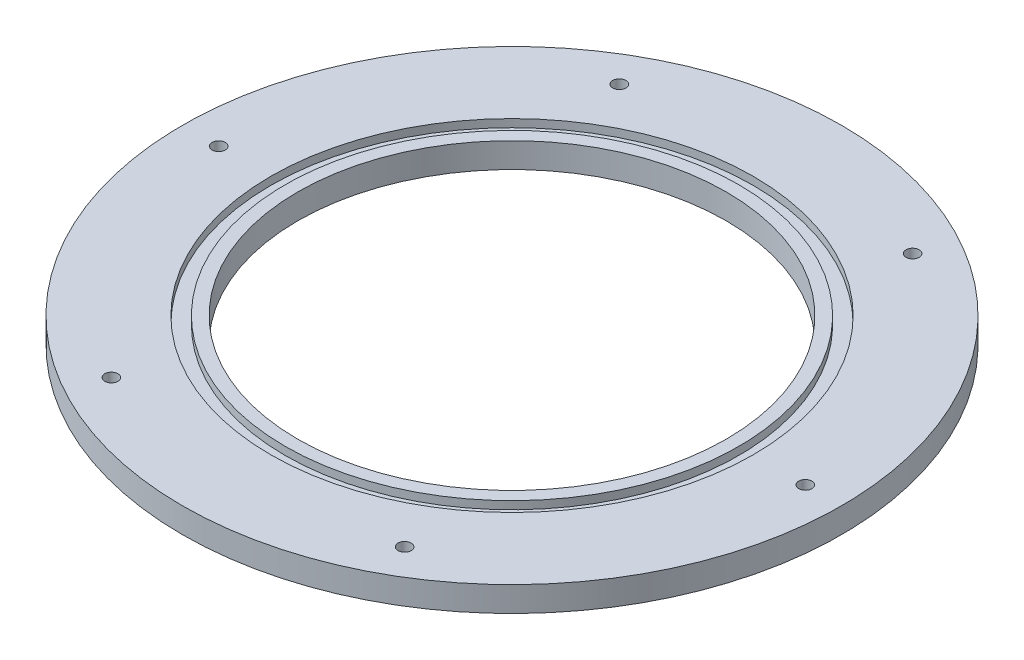
ISO-10303-21;
HEADER;
FILE_DESCRIPTION(('STEP AP214'),'2;1');
FILE_NAME('part.step','',(''),(''),'','','');
FILE_SCHEMA(('AUTOMOTIVE_DESIGN { 1 0 10303 214 1 1 1 1 }'));
ENDSEC;
DATA;
#1=APPLICATION_CONTEXT('core data for automotive mechanical design processes');
#2=APPLICATION_PROTOCOL_DEFINITION('international standard','automotive_design',2000,#1);
#3=PRODUCT_CONTEXT('',#1,'mechanical');
#4=PRODUCT('Part','Part','',(#3));
#5=PRODUCT_RELATED_PRODUCT_CATEGORY('part','',(#4));
#6=PRODUCT_DEFINITION_FORMATION('','',#4);
#7=PRODUCT_DEFINITION_CONTEXT('part definition',#1,'design');
#8=PRODUCT_DEFINITION('design','',#6,#7);
#9=PRODUCT_DEFINITION_SHAPE('','',#8);
#10=(LENGTH_UNIT() NAMED_UNIT(*) SI_UNIT(.MILLI.,.METRE.));
#11=(NAMED_UNIT(*) PLANE_ANGLE_UNIT() SI_UNIT($,.RADIAN.));
#12=(NAMED_UNIT(*) SI_UNIT($,.STERADIAN.) SOLID_ANGLE_UNIT());
#13=UNCERTAINTY_MEASURE_WITH_UNIT(LENGTH_MEASURE(1.E-05),#10,'distance_accuracy_value','');
#14=(GEOMETRIC_REPRESENTATION_CONTEXT(3) GLOBAL_UNCERTAINTY_ASSIGNED_CONTEXT((#13)) GLOBAL_UNIT_ASSIGNED_CONTEXT((#10,
#11,#12)) REPRESENTATION_CONTEXT('',''));
#15=CARTESIAN_POINT('',(0.,0.,0.));
#16=DIRECTION('',(0.,0.,1.));
#17=DIRECTION('',(1.,0.,0.));
#18=AXIS2_PLACEMENT_3D('',#15,#16,#17);
#19=CARTESIAN_POINT('',(0.,9.5,0.));
#20=DIRECTION('',(0.,1.,0.));
#21=DIRECTION('',(0.,0.,1.));
#22=AXIS2_PLACEMENT_3D('',#19,#20,#21);
#23=PLANE('',#22);
#24=CARTESIAN_POINT('',(0.,9.5,0.));
#25=DIRECTION('',(0.,1.,0.));
#26=DIRECTION('',(0.,0.,1.));
#27=AXIS2_PLACEMENT_3D('',#24,#25,#26);
#28=CIRCLE('',#27,162.5);
#29=CARTESIAN_POINT('',(0.,9.5,162.5));
#30=VERTEX_POINT('',#29);
#31=EDGE_CURVE('E49',#30,#30,#28,.T.);
#32=ORIENTED_EDGE('',*,*,#31,.F.);
#33=EDGE_LOOP('',(#32));
#34=FACE_BOUND('',#33,.T.);
#35=CARTESIAN_POINT('',(0.,9.5,0.));
#36=DIRECTION('',(0.,1.,0.));
#37=DIRECTION('',(0.,0.,1.));
#38=AXIS2_PLACEMENT_3D('',#35,#36,#37);
#39=CIRCLE('',#38,172.);
#40=CARTESIAN_POINT('',(0.,9.5,172.));
#41=VERTEX_POINT('',#40);
#42=EDGE_CURVE('E115',#41,#41,#39,.T.);
#43=ORIENTED_EDGE('',*,*,#42,.T.);
#44=EDGE_LOOP('',(#43));
#45=FACE_BOUND('',#44,.T.);
#46=ADVANCED_FACE('F36',(#34,#45),#23,.T.);
#47=CARTESIAN_POINT('',(0.,9.5,0.));
#48=DIRECTION('',(0.,1.,0.));
#49=DIRECTION('',(0.,0.,1.));
#50=AXIS2_PLACEMENT_3D('',#47,#48,#49);
#51=CIRCLE('',#50,183.);
#52=CARTESIAN_POINT('',(0.,9.5,183.));
#53=VERTEX_POINT('',#52);
#54=EDGE_CURVE('E107',#53,#53,#51,.T.);
#55=ORIENTED_EDGE('',*,*,#54,.F.);
#56=EDGE_LOOP('',(#55));
#57=FACE_BOUND('',#56,.T.);
#58=CARTESIAN_POINT('',(111.25,9.5,192.690652342038));
#59=DIRECTION('',(0.,1.,0.));
#60=DIRECTION('',(0.,0.,-1.));
#61=AXIS2_PLACEMENT_3D('',#58,#59,#60);
#62=CIRCLE('',#61,5.00000000000001);
#63=CARTESIAN_POINT('',(111.25,9.5,187.690652342038));
#64=VERTEX_POINT('',#63);
#65=EDGE_CURVE('E83',#64,#64,#62,.T.);
#66=ORIENTED_EDGE('',*,*,#65,.F.);
#67=EDGE_LOOP('',(#66));
#68=FACE_BOUND('',#67,.T.);
#69=CARTESIAN_POINT('',(-111.250000000001,9.5,-192.690652342037));
#70=DIRECTION('',(0.,1.,0.));
#71=DIRECTION('',(0.,0.,-1.));
#72=AXIS2_PLACEMENT_3D('',#69,#70,#71);
#73=CIRCLE('',#72,5.00000000000001);
#74=CARTESIAN_POINT('',(-111.250000000001,9.5,-197.690652342037));
#75=VERTEX_POINT('',#74);
#76=EDGE_CURVE('E92',#75,#75,#73,.T.);
#77=ORIENTED_EDGE('',*,*,#76,.F.);
#78=EDGE_LOOP('',(#77));
#79=FACE_BOUND('',#78,.T.);
#80=CARTESIAN_POINT('',(-222.5,9.5,1.55431223447522E-12));
#81=DIRECTION('',(0.,1.,0.));
#82=DIRECTION('',(0.,0.,-1.));
#83=AXIS2_PLACEMENT_3D('',#80,#81,#82);
#84=CIRCLE('',#83,4.99999999999992);
#85=CARTESIAN_POINT('',(-222.5,9.5,-4.99999999999837));
#86=VERTEX_POINT('',#85);
#87=EDGE_CURVE('E67',#86,#86,#84,.T.);
#88=ORIENTED_EDGE('',*,*,#87,.F.);
#89=EDGE_LOOP('',(#88));
#90=FACE_BOUND('',#89,.T.);
#91=CARTESIAN_POINT('',(222.5,9.5,0.));
#92=DIRECTION('',(0.,1.,0.));
#93=DIRECTION('',(0.,0.,1.));
#94=AXIS2_PLACEMENT_3D('',#91,#92,#93);
#95=CIRCLE('',#94,4.99999999999999);
#96=CARTESIAN_POINT('',(222.5,9.5,4.99999999999999));
#97=VERTEX_POINT('',#96);
#98=EDGE_CURVE('E76',#97,#97,#95,.T.);
#99=ORIENTED_EDGE('',*,*,#98,.F.);
#100=EDGE_LOOP('',(#99));
#101=FACE_BOUND('',#100,.T.);
#102=CARTESIAN_POINT('',(-111.250000000001,9.5,192.690652342037));
#103=DIRECTION('',(0.,1.,0.));
#104=DIRECTION('',(0.,0.,1.));
#105=AXIS2_PLACEMENT_3D('',#102,#103,#104);
#106=CIRCLE('',#105,5.00000000000001);
#107=CARTESIAN_POINT('',(-111.250000000001,9.5,197.690652342037));
#108=VERTEX_POINT('',#107);
#109=EDGE_CURVE('E99',#108,#108,#106,.T.);
#110=ORIENTED_EDGE('',*,*,#109,.F.);
#111=EDGE_LOOP('',(#110));
#112=FACE_BOUND('',#111,.T.);
#113=CARTESIAN_POINT('',(111.25,9.5,-192.690652342038));
#114=DIRECTION('',(0.,1.,0.));
#115=DIRECTION('',(0.,0.,1.));
#116=AXIS2_PLACEMENT_3D('',#113,#114,#115);
#117=CIRCLE('',#116,5.00000000000001);
#118=CARTESIAN_POINT('',(111.25,9.5,-187.690652342038));
#119=VERTEX_POINT('',#118);
#120=EDGE_CURVE('E59',#119,#119,#117,.T.);
#121=ORIENTED_EDGE('',*,*,#120,.F.);
#122=EDGE_LOOP('',(#121));
#123=FACE_BOUND('',#122,.T.);
#124=CARTESIAN_POINT('',(0.,9.5,0.));
#125=DIRECTION('',(0.,1.,0.));
#126=DIRECTION('',(0.,0.,1.));
#127=AXIS2_PLACEMENT_3D('',#124,#125,#126);
#128=CIRCLE('',#127,250.);
#129=CARTESIAN_POINT('',(0.,9.5,250.));
#130=VERTEX_POINT('',#129);
#131=EDGE_CURVE('E10',#130,#130,#128,.T.);
#132=ORIENTED_EDGE('',*,*,#131,.T.);
#133=EDGE_LOOP('',(#132));
#134=FACE_BOUND('',#133,.T.);
#135=ADVANCED_FACE('F139',(#57,#68,#79,#90,#101,#112,#123,#134),#23,.T.);
#136=CARTESIAN_POINT('',(0.,-9.5,0.));
#137=DIRECTION('',(0.,1.,0.));
#138=DIRECTION('',(0.,0.,1.));
#139=AXIS2_PLACEMENT_3D('',#136,#137,#138);
#140=PLANE('',#139);
#141=CARTESIAN_POINT('',(111.25,-9.5,192.690652342038));
#142=DIRECTION('',(0.,1.,0.));
#143=DIRECTION('',(0.,0.,-1.));
#144=AXIS2_PLACEMENT_3D('',#141,#142,#143);
#145=CIRCLE('',#144,5.00000000000001);
#146=CARTESIAN_POINT('',(111.25,-9.5,187.690652342038));
#147=VERTEX_POINT('',#146);
#148=EDGE_CURVE('E87',#147,#147,#145,.T.);
#149=ORIENTED_EDGE('',*,*,#148,.T.);
#150=EDGE_LOOP('',(#149));
#151=FACE_BOUND('',#150,.T.);
#152=CARTESIAN_POINT('',(-111.250000000001,-9.5,-192.690652342037));
#153=DIRECTION('',(0.,1.,0.));
#154=DIRECTION('',(0.,0.,-1.));
#155=AXIS2_PLACEMENT_3D('',#152,#153,#154);
#156=CIRCLE('',#155,5.00000000000001);
#157=CARTESIAN_POINT('',(-111.250000000001,-9.5,-197.690652342037));
#158=VERTEX_POINT('',#157);
#159=EDGE_CURVE('E72',#158,#158,#156,.T.);
#160=ORIENTED_EDGE('',*,*,#159,.T.);
#161=EDGE_LOOP('',(#160));
#162=FACE_BOUND('',#161,.T.);
#163=CARTESIAN_POINT('',(-222.5,-9.5,1.55431223447522E-12));
#164=DIRECTION('',(0.,1.,0.));
#165=DIRECTION('',(0.,0.,-1.));
#166=AXIS2_PLACEMENT_3D('',#163,#164,#165);
#167=CIRCLE('',#166,4.99999999999992);
#168=CARTESIAN_POINT('',(-222.5,-9.5,-4.99999999999837));
#169=VERTEX_POINT('',#168);
#170=EDGE_CURVE('E71',#169,#169,#167,.T.);
#171=ORIENTED_EDGE('',*,*,#170,.T.);
#172=EDGE_LOOP('',(#171));
#173=FACE_BOUND('',#172,.T.);
#174=CARTESIAN_POINT('',(222.5,-9.5,0.));
#175=DIRECTION('',(0.,1.,0.));
#176=DIRECTION('',(0.,0.,1.));
#177=AXIS2_PLACEMENT_3D('',#174,#175,#176);
#178=CIRCLE('',#177,4.99999999999999);
#179=CARTESIAN_POINT('',(222.5,-9.5,4.99999999999999));
#180=VERTEX_POINT('',#179);
#181=EDGE_CURVE('E63',#180,#180,#178,.T.);
#182=ORIENTED_EDGE('',*,*,#181,.T.);
#183=EDGE_LOOP('',(#182));
#184=FACE_BOUND('',#183,.T.);
#185=CARTESIAN_POINT('',(-111.250000000001,-9.5,192.690652342037));
#186=DIRECTION('',(0.,1.,0.));
#187=DIRECTION('',(0.,0.,1.));
#188=AXIS2_PLACEMENT_3D('',#185,#186,#187);
#189=CIRCLE('',#188,5.00000000000001);
#190=CARTESIAN_POINT('',(-111.250000000001,-9.5,197.690652342037));
#191=VERTEX_POINT('',#190);
#192=EDGE_CURVE('E88',#191,#191,#189,.T.);
#193=ORIENTED_EDGE('',*,*,#192,.T.);
#194=EDGE_LOOP('',(#193));
#195=FACE_BOUND('',#194,.T.);
#196=CARTESIAN_POINT('',(111.25,-9.5,-192.690652342038));
#197=DIRECTION('',(0.,1.,0.));
#198=DIRECTION('',(0.,0.,1.));
#199=AXIS2_PLACEMENT_3D('',#196,#197,#198);
#200=CIRCLE('',#199,5.00000000000001);
#201=CARTESIAN_POINT('',(111.25,-9.5,-187.690652342038));
#202=VERTEX_POINT('',#201);
#203=EDGE_CURVE('E55',#202,#202,#200,.T.);
#204=ORIENTED_EDGE('',*,*,#203,.T.);
#205=EDGE_LOOP('',(#204));
#206=FACE_BOUND('',#205,.T.);
#207=CARTESIAN_POINT('',(0.,-9.5,0.));
#208=DIRECTION('',(0.,1.,0.));
#209=DIRECTION('',(0.,0.,1.));
#210=AXIS2_PLACEMENT_3D('',#207,#208,#209);
#211=CIRCLE('',#210,250.);
#212=CARTESIAN_POINT('',(0.,-9.5,250.));
#213=VERTEX_POINT('',#212);
#214=EDGE_CURVE('E40',#213,#213,#211,.T.);
#215=ORIENTED_EDGE('',*,*,#214,.F.);
#216=EDGE_LOOP('',(#215));
#217=FACE_BOUND('',#216,.T.);
#218=CARTESIAN_POINT('',(0.,-9.5,0.));
#219=DIRECTION('',(0.,1.,0.));
#220=DIRECTION('',(0.,0.,1.));
#221=AXIS2_PLACEMENT_3D('',#218,#219,#220);
#222=CIRCLE('',#221,162.5);
#223=CARTESIAN_POINT('',(0.,-9.5,162.5));
#224=VERTEX_POINT('',#223);
#225=EDGE_CURVE('E51',#224,#224,#222,.T.);
#226=ORIENTED_EDGE('',*,*,#225,.T.);
#227=EDGE_LOOP('',(#226));
#228=FACE_BOUND('',#227,.T.);
#229=ADVANCED_FACE('F142',(#151,#162,#173,#184,#195,#206,#217,#228),#140,.F.);
#230=CARTESIAN_POINT('',(0.,9.5,0.));
#231=DIRECTION('',(0.,-1.,0.));
#232=DIRECTION('',(0.,0.,-1.));
#233=AXIS2_PLACEMENT_3D('',#230,#231,#232);
#234=CYLINDRICAL_SURFACE('',#233,250.);
#235=ORIENTED_EDGE('',*,*,#131,.F.);
#236=EDGE_LOOP('',(#235));
#237=FACE_BOUND('',#236,.T.);
#238=ORIENTED_EDGE('',*,*,#214,.T.);
#239=EDGE_LOOP('',(#238));
#240=FACE_BOUND('',#239,.T.);
#241=ADVANCED_FACE('F38',(#237,#240),#234,.T.);
#242=CARTESIAN_POINT('',(0.,9.5,0.));
#243=DIRECTION('',(0.,-1.,0.));
#244=DIRECTION('',(0.,0.,-1.));
#245=AXIS2_PLACEMENT_3D('',#242,#243,#244);
#246=CYLINDRICAL_SURFACE('',#245,162.5);
#247=ORIENTED_EDGE('',*,*,#31,.T.);
#248=EDGE_LOOP('',(#247));
#249=FACE_BOUND('',#248,.T.);
#250=ORIENTED_EDGE('',*,*,#225,.F.);
#251=EDGE_LOOP('',(#250));
#252=FACE_BOUND('',#251,.T.);
#253=ADVANCED_FACE('F159',(#249,#252),#246,.F.);
#254=CARTESIAN_POINT('',(111.25,-9.5,-192.690652342038));
#255=DIRECTION('',(0.,1.,0.));
#256=DIRECTION('',(0.,0.,1.));
#257=AXIS2_PLACEMENT_3D('',#254,#255,#256);
#258=CYLINDRICAL_SURFACE('',#257,5.00000000000001);
#259=ORIENTED_EDGE('',*,*,#203,.F.);
#260=EDGE_LOOP('',(#259));
#261=FACE_BOUND('',#260,.T.);
#262=ORIENTED_EDGE('',*,*,#120,.T.);
#263=EDGE_LOOP('',(#262));
#264=FACE_BOUND('',#263,.T.);
#265=ADVANCED_FACE('F156',(#261,#264),#258,.F.);
#266=CARTESIAN_POINT('',(-111.250000000001,-9.5,192.690652342037));
#267=DIRECTION('',(0.,1.,0.));
#268=DIRECTION('',(0.,0.,1.));
#269=AXIS2_PLACEMENT_3D('',#266,#267,#268);
#270=CYLINDRICAL_SURFACE('',#269,5.00000000000001);
#271=ORIENTED_EDGE('',*,*,#192,.F.);
#272=EDGE_LOOP('',(#271));
#273=FACE_BOUND('',#272,.T.);
#274=ORIENTED_EDGE('',*,*,#109,.T.);
#275=EDGE_LOOP('',(#274));
#276=FACE_BOUND('',#275,.T.);
#277=ADVANCED_FACE('F158',(#273,#276),#270,.F.);
#278=CARTESIAN_POINT('',(222.5,-9.5,0.));
#279=DIRECTION('',(0.,1.,0.));
#280=DIRECTION('',(0.,0.,1.));
#281=AXIS2_PLACEMENT_3D('',#278,#279,#280);
#282=CYLINDRICAL_SURFACE('',#281,4.99999999999999);
#283=ORIENTED_EDGE('',*,*,#181,.F.);
#284=EDGE_LOOP('',(#283));
#285=FACE_BOUND('',#284,.T.);
#286=ORIENTED_EDGE('',*,*,#98,.T.);
#287=EDGE_LOOP('',(#286));
#288=FACE_BOUND('',#287,.T.);
#289=ADVANCED_FACE('F166',(#285,#288),#282,.F.);
#290=CARTESIAN_POINT('',(-222.5,-9.5,1.55431223447522E-12));
#291=DIRECTION('',(0.,1.,0.));
#292=DIRECTION('',(0.,0.,1.));
#293=AXIS2_PLACEMENT_3D('',#290,#291,#292);
#294=CYLINDRICAL_SURFACE('',#293,4.99999999999992);
#295=ORIENTED_EDGE('',*,*,#170,.F.);
#296=EDGE_LOOP('',(#295));
#297=FACE_BOUND('',#296,.T.);
#298=ORIENTED_EDGE('',*,*,#87,.T.);
#299=EDGE_LOOP('',(#298));
#300=FACE_BOUND('',#299,.T.);
#301=ADVANCED_FACE('F207',(#297,#300),#294,.F.);
#302=CARTESIAN_POINT('',(-111.250000000001,-9.5,-192.690652342037));
#303=DIRECTION('',(0.,1.,0.));
#304=DIRECTION('',(0.,0.,1.));
#305=AXIS2_PLACEMENT_3D('',#302,#303,#304);
#306=CYLINDRICAL_SURFACE('',#305,5.00000000000001);
#307=ORIENTED_EDGE('',*,*,#159,.F.);
#308=EDGE_LOOP('',(#307));
#309=FACE_BOUND('',#308,.T.);
#310=ORIENTED_EDGE('',*,*,#76,.T.);
#311=EDGE_LOOP('',(#310));
#312=FACE_BOUND('',#311,.T.);
#313=ADVANCED_FACE('F212',(#309,#312),#306,.F.);
#314=CARTESIAN_POINT('',(111.25,-9.5,192.690652342038));
#315=DIRECTION('',(0.,1.,0.));
#316=DIRECTION('',(0.,0.,1.));
#317=AXIS2_PLACEMENT_3D('',#314,#315,#316);
#318=CYLINDRICAL_SURFACE('',#317,5.00000000000001);
#319=ORIENTED_EDGE('',*,*,#148,.F.);
#320=EDGE_LOOP('',(#319));
#321=FACE_BOUND('',#320,.T.);
#322=ORIENTED_EDGE('',*,*,#65,.T.);
#323=EDGE_LOOP('',(#322));
#324=FACE_BOUND('',#323,.T.);
#325=ADVANCED_FACE('F135',(#321,#324),#318,.F.);
#326=CARTESIAN_POINT('',(0.,3.5,0.));
#327=DIRECTION('',(0.,1.,0.));
#328=DIRECTION('',(0.,0.,1.));
#329=AXIS2_PLACEMENT_3D('',#326,#327,#328);
#330=CYLINDRICAL_SURFACE('',#329,183.);
#331=CARTESIAN_POINT('',(0.,3.5,0.));
#332=DIRECTION('',(0.,1.,0.));
#333=DIRECTION('',(0.,0.,1.));
#334=AXIS2_PLACEMENT_3D('',#331,#332,#333);
#335=CIRCLE('',#334,183.);
#336=CARTESIAN_POINT('',(0.,3.5,183.));
#337=VERTEX_POINT('',#336);
#338=EDGE_CURVE('E103',#337,#337,#335,.T.);
#339=ORIENTED_EDGE('',*,*,#338,.F.);
#340=EDGE_LOOP('',(#339));
#341=FACE_BOUND('',#340,.T.);
#342=ORIENTED_EDGE('',*,*,#54,.T.);
#343=EDGE_LOOP('',(#342));
#344=FACE_BOUND('',#343,.T.);
#345=ADVANCED_FACE('F129',(#341,#344),#330,.F.);
#346=CARTESIAN_POINT('',(0.,3.5,0.));
#347=DIRECTION('',(0.,1.,0.));
#348=DIRECTION('',(0.,0.,1.));
#349=AXIS2_PLACEMENT_3D('',#346,#347,#348);
#350=PLANE('',#349);
#351=CARTESIAN_POINT('',(0.,3.5,0.));
#352=DIRECTION('',(0.,1.,0.));
#353=DIRECTION('',(0.,0.,1.));
#354=AXIS2_PLACEMENT_3D('',#351,#352,#353);
#355=CIRCLE('',#354,172.);
#356=CARTESIAN_POINT('',(0.,3.5,172.));
#357=VERTEX_POINT('',#356);
#358=EDGE_CURVE('E111',#357,#357,#355,.T.);
#359=ORIENTED_EDGE('',*,*,#358,.F.);
#360=EDGE_LOOP('',(#359));
#361=FACE_BOUND('',#360,.T.);
#362=ORIENTED_EDGE('',*,*,#338,.T.);
#363=EDGE_LOOP('',(#362));
#364=FACE_BOUND('',#363,.T.);
#365=ADVANCED_FACE('F126',(#361,#364),#350,.T.);
#366=CARTESIAN_POINT('',(0.,3.5,0.));
#367=DIRECTION('',(0.,1.,0.));
#368=DIRECTION('',(0.,0.,1.));
#369=AXIS2_PLACEMENT_3D('',#366,#367,#368);
#370=CYLINDRICAL_SURFACE('',#369,172.);
#371=ORIENTED_EDGE('',*,*,#358,.T.);
#372=EDGE_LOOP('',(#371));
#373=FACE_BOUND('',#372,.T.);
#374=ORIENTED_EDGE('',*,*,#42,.F.);
#375=EDGE_LOOP('',(#374));
#376=FACE_BOUND('',#375,.T.);
#377=ADVANCED_FACE('F123',(#373,#376),#370,.T.);
#378=CLOSED_SHELL('',(#46,#135,#229,#241,#253,#265,#277,#289,#301,#313,#325,#345,#365,#377));
#379=MANIFOLD_SOLID_BREP('B2',#378);
#380=ADVANCED_BREP_SHAPE_REPRESENTATION('',(#18,#379),#14);
#381=SHAPE_DEFINITION_REPRESENTATION(#9,#380);
ENDSEC;
END-ISO-10303-21;
